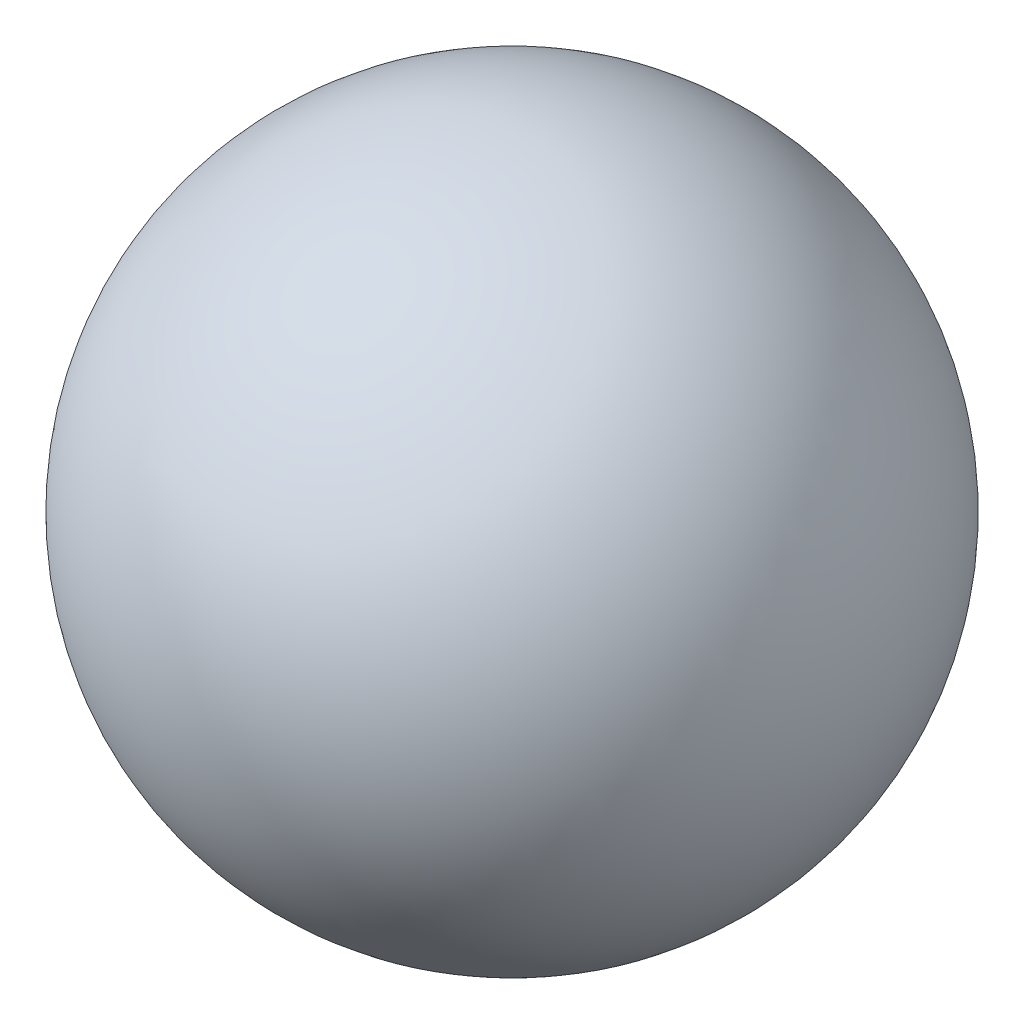
ISO-10303-21;
HEADER;
FILE_DESCRIPTION(('STEP AP214'),'2;1');
FILE_NAME('part.step','',(''),(''),'','','');
FILE_SCHEMA(('AUTOMOTIVE_DESIGN { 1 0 10303 214 1 1 1 1 }'));
ENDSEC;
DATA;
#1=APPLICATION_CONTEXT('core data for automotive mechanical design processes');
#2=APPLICATION_PROTOCOL_DEFINITION('international standard','automotive_design',2000,#1);
#3=PRODUCT_CONTEXT('',#1,'mechanical');
#4=PRODUCT('Part','Part','',(#3));
#5=PRODUCT_RELATED_PRODUCT_CATEGORY('part','',(#4));
#6=PRODUCT_DEFINITION_FORMATION('','',#4);
#7=PRODUCT_DEFINITION_CONTEXT('part definition',#1,'design');
#8=PRODUCT_DEFINITION('design','',#6,#7);
#9=PRODUCT_DEFINITION_SHAPE('','',#8);
#10=(LENGTH_UNIT() NAMED_UNIT(*) SI_UNIT(.MILLI.,.METRE.));
#11=(NAMED_UNIT(*) PLANE_ANGLE_UNIT() SI_UNIT($,.RADIAN.));
#12=(NAMED_UNIT(*) SI_UNIT($,.STERADIAN.) SOLID_ANGLE_UNIT());
#13=UNCERTAINTY_MEASURE_WITH_UNIT(LENGTH_MEASURE(1.E-05),#10,'distance_accuracy_value','');
#14=(GEOMETRIC_REPRESENTATION_CONTEXT(3) GLOBAL_UNCERTAINTY_ASSIGNED_CONTEXT((#13)) GLOBAL_UNIT_ASSIGNED_CONTEXT((#10,
#11,#12)) REPRESENTATION_CONTEXT('',''));
#15=CARTESIAN_POINT('',(0.,0.,0.));
#16=DIRECTION('',(0.,0.,1.));
#17=DIRECTION('',(1.,0.,0.));
#18=AXIS2_PLACEMENT_3D('',#15,#16,#17);
#19=CARTESIAN_POINT('',(0.,0.,0.));
#20=DIRECTION('',(0.,1.,0.));
#21=DIRECTION('',(1.,0.,0.));
#22=AXIS2_PLACEMENT_3D('',#19,#20,#21);
#23=SPHERICAL_SURFACE('',#22,7.14);
#24=CARTESIAN_POINT('',(0.,7.14,0.));
#25=VERTEX_POINT('',#24);
#26=VERTEX_LOOP('',#25);
#27=FACE_BOUND('',#26,.T.);
#28=ADVANCED_FACE('F37',(#27),#23,.T.);
#29=CLOSED_SHELL('',(#28));
#30=MANIFOLD_SOLID_BREP('B2',#29);
#31=ADVANCED_BREP_SHAPE_REPRESENTATION('',(#18,#30),#14);
#32=SHAPE_DEFINITION_REPRESENTATION(#9,#31);
ENDSEC;
END-ISO-10303-21;
